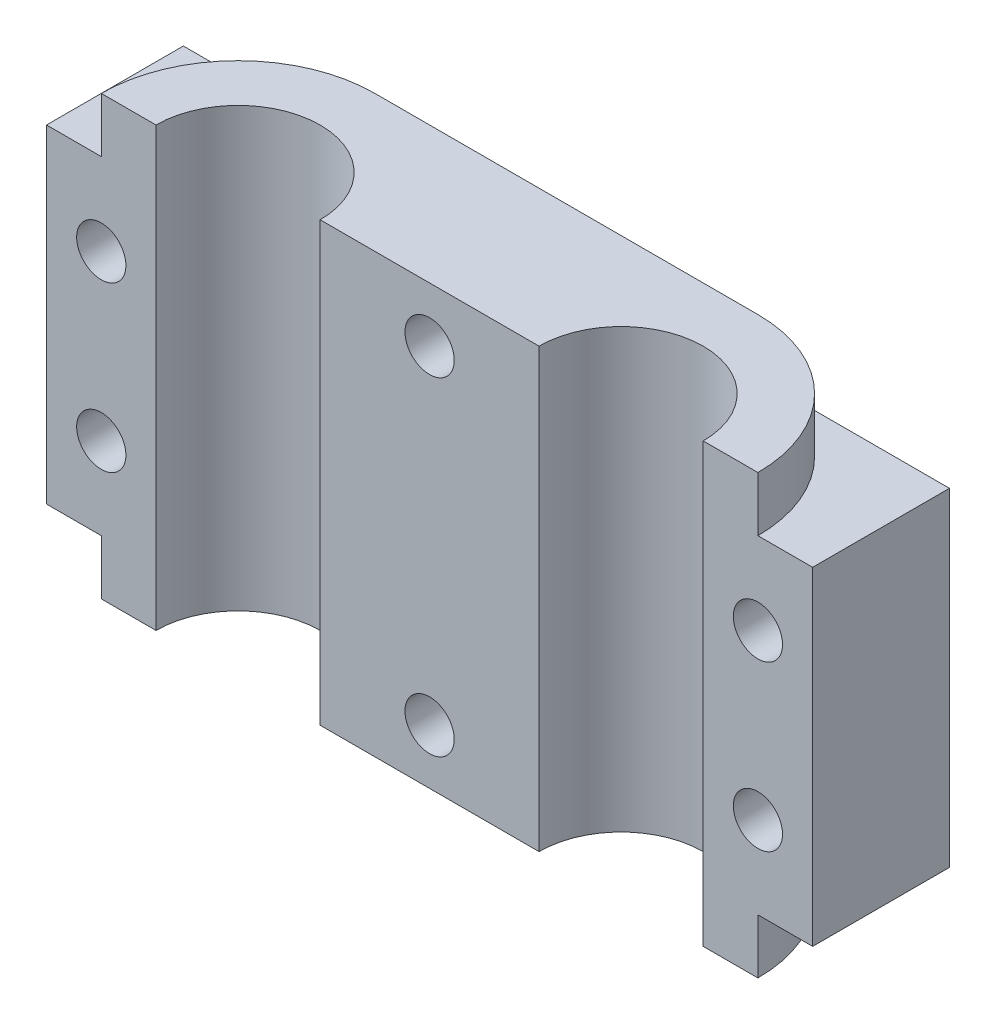
ISO-10303-21;
HEADER;
FILE_DESCRIPTION(('STEP AP214'),'2;1');
FILE_NAME('part.step','',(''),(''),'','','');
FILE_SCHEMA(('AUTOMOTIVE_DESIGN { 1 0 10303 214 1 1 1 1 }'));
ENDSEC;
DATA;
#1=APPLICATION_CONTEXT('core data for automotive mechanical design processes');
#2=APPLICATION_PROTOCOL_DEFINITION('international standard','automotive_design',2000,#1);
#3=PRODUCT_CONTEXT('',#1,'mechanical');
#4=PRODUCT('Part','Part','',(#3));
#5=PRODUCT_RELATED_PRODUCT_CATEGORY('part','',(#4));
#6=PRODUCT_DEFINITION_FORMATION('','',#4);
#7=PRODUCT_DEFINITION_CONTEXT('part definition',#1,'design');
#8=PRODUCT_DEFINITION('design','',#6,#7);
#9=PRODUCT_DEFINITION_SHAPE('','',#8);
#10=(LENGTH_UNIT() NAMED_UNIT(*) SI_UNIT(.MILLI.,.METRE.));
#11=(NAMED_UNIT(*) PLANE_ANGLE_UNIT() SI_UNIT($,.RADIAN.));
#12=(NAMED_UNIT(*) SI_UNIT($,.STERADIAN.) SOLID_ANGLE_UNIT());
#13=UNCERTAINTY_MEASURE_WITH_UNIT(LENGTH_MEASURE(1.E-05),#10,'distance_accuracy_value','');
#14=(GEOMETRIC_REPRESENTATION_CONTEXT(3) GLOBAL_UNCERTAINTY_ASSIGNED_CONTEXT((#13)) GLOBAL_UNIT_ASSIGNED_CONTEXT((#10,
#11,#12)) REPRESENTATION_CONTEXT('',''));
#15=CARTESIAN_POINT('',(0.,0.,0.));
#16=DIRECTION('',(0.,0.,1.));
#17=DIRECTION('',(1.,0.,0.));
#18=AXIS2_PLACEMENT_3D('',#15,#16,#17);
#19=CARTESIAN_POINT('',(-17.5,15.,12.6162790697674));
#20=DIRECTION('',(0.,-1.,0.));
#21=DIRECTION('',(0.,0.,-1.));
#22=AXIS2_PLACEMENT_3D('',#19,#20,#21);
#23=PLANE('',#22);
#24=DIRECTION('',(1.,0.,0.));
#25=VECTOR('',#24,1.);
#26=CARTESIAN_POINT('',(-35.,15.,12.6162790697674));
#27=LINE('',#26,#25);
#28=CARTESIAN_POINT('',(-35.,15.,12.6162790697674));
#29=VERTEX_POINT('',#28);
#30=CARTESIAN_POINT('',(-30.,15.,12.6162790697674));
#31=VERTEX_POINT('',#30);
#32=EDGE_CURVE('E232',#29,#31,#27,.T.);
#33=ORIENTED_EDGE('',*,*,#32,.T.);
#34=CARTESIAN_POINT('',(-17.5,15.,12.6162790697674));
#35=DIRECTION('',(0.,-1.,0.));
#36=DIRECTION('',(0.,0.,-1.));
#37=AXIS2_PLACEMENT_3D('',#34,#35,#36);
#38=CIRCLE('',#37,12.5);
#39=CARTESIAN_POINT('',(-17.5,15.,0.116279069767435));
#40=VERTEX_POINT('',#39);
#41=EDGE_CURVE('E52',#31,#40,#38,.T.);
#42=ORIENTED_EDGE('',*,*,#41,.T.);
#43=DIRECTION('',(-1.,0.,0.));
#44=VECTOR('',#43,1.);
#45=CARTESIAN_POINT('',(-35.,15.,0.116279069767435));
#46=LINE('',#45,#44);
#47=CARTESIAN_POINT('',(-35.,15.,0.116279069767435));
#48=VERTEX_POINT('',#47);
#49=EDGE_CURVE('E239',#40,#48,#46,.T.);
#50=ORIENTED_EDGE('',*,*,#49,.T.);
#51=DIRECTION('',(0.,0.,1.));
#52=VECTOR('',#51,1.);
#53=CARTESIAN_POINT('',(-35.,15.,0.116279069767435));
#54=LINE('',#53,#52);
#55=EDGE_CURVE('E241',#48,#29,#54,.T.);
#56=ORIENTED_EDGE('',*,*,#55,.T.);
#57=EDGE_LOOP('',(#33,#42,#50,#56));
#58=FACE_BOUND('',#57,.T.);
#59=ADVANCED_FACE('F37',(#58),#23,.F.);
#60=CARTESIAN_POINT('',(-17.5,-15.,12.6162790697674));
#61=DIRECTION('',(0.,-1.,0.));
#62=DIRECTION('',(0.,0.,-1.));
#63=AXIS2_PLACEMENT_3D('',#60,#61,#62);
#64=PLANE('',#63);
#65=CARTESIAN_POINT('',(-17.5,-15.,12.6162790697674));
#66=DIRECTION('',(0.,-1.,0.));
#67=DIRECTION('',(0.,0.,-1.));
#68=AXIS2_PLACEMENT_3D('',#65,#66,#67);
#69=CIRCLE('',#68,12.5);
#70=CARTESIAN_POINT('',(-30.,-15.,12.6162790697674));
#71=VERTEX_POINT('',#70);
#72=CARTESIAN_POINT('',(-17.5,-15.,0.116279069767435));
#73=VERTEX_POINT('',#72);
#74=EDGE_CURVE('E11',#71,#73,#69,.T.);
#75=ORIENTED_EDGE('',*,*,#74,.F.);
#76=DIRECTION('',(1.,0.,0.));
#77=VECTOR('',#76,1.);
#78=CARTESIAN_POINT('',(-35.,-15.,12.6162790697674));
#79=LINE('',#78,#77);
#80=CARTESIAN_POINT('',(-35.,-15.,12.6162790697674));
#81=VERTEX_POINT('',#80);
#82=EDGE_CURVE('E231',#81,#71,#79,.T.);
#83=ORIENTED_EDGE('',*,*,#82,.F.);
#84=DIRECTION('',(0.,0.,1.));
#85=VECTOR('',#84,1.);
#86=CARTESIAN_POINT('',(-35.,-15.,0.116279069767435));
#87=LINE('',#86,#85);
#88=CARTESIAN_POINT('',(-35.,-15.,0.116279069767435));
#89=VERTEX_POINT('',#88);
#90=EDGE_CURVE('E235',#89,#81,#87,.T.);
#91=ORIENTED_EDGE('',*,*,#90,.F.);
#92=DIRECTION('',(-1.,0.,0.));
#93=VECTOR('',#92,1.);
#94=CARTESIAN_POINT('',(-35.,-15.,0.116279069767435));
#95=LINE('',#94,#93);
#96=EDGE_CURVE('E249',#73,#89,#95,.T.);
#97=ORIENTED_EDGE('',*,*,#96,.F.);
#98=EDGE_LOOP('',(#75,#83,#91,#97));
#99=FACE_BOUND('',#98,.T.);
#100=ADVANCED_FACE('F308',(#99),#64,.T.);
#101=CARTESIAN_POINT('',(-35.,15.,12.6162790697674));
#102=DIRECTION('',(0.,0.,-1.));
#103=DIRECTION('',(-1.,0.,0.));
#104=AXIS2_PLACEMENT_3D('',#101,#102,#103);
#105=PLANE('',#104);
#106=CARTESIAN_POINT('',(-30.,-7.5,12.6162790697674));
#107=DIRECTION('',(0.,0.,1.));
#108=DIRECTION('',(1.,0.,0.));
#109=AXIS2_PLACEMENT_3D('',#106,#107,#108);
#110=CIRCLE('',#109,2.25);
#111=CARTESIAN_POINT('',(-27.75,-7.5,12.6162790697674));
#112=VERTEX_POINT('',#111);
#113=EDGE_CURVE('E361',#112,#112,#110,.T.);
#114=ORIENTED_EDGE('',*,*,#113,.F.);
#115=EDGE_LOOP('',(#114));
#116=FACE_BOUND('',#115,.T.);
#117=CARTESIAN_POINT('',(-30.,7.5,12.6162790697674));
#118=DIRECTION('',(0.,0.,1.));
#119=DIRECTION('',(1.,0.,0.));
#120=AXIS2_PLACEMENT_3D('',#117,#118,#119);
#121=CIRCLE('',#120,2.25);
#122=CARTESIAN_POINT('',(-27.75,7.5,12.6162790697674));
#123=VERTEX_POINT('',#122);
#124=EDGE_CURVE('E178',#123,#123,#121,.T.);
#125=ORIENTED_EDGE('',*,*,#124,.F.);
#126=EDGE_LOOP('',(#125));
#127=FACE_BOUND('',#126,.T.);
#128=ORIENTED_EDGE('',*,*,#82,.T.);
#129=DIRECTION('',(0.,1.,0.));
#130=VECTOR('',#129,1.);
#131=CARTESIAN_POINT('',(-30.,-20.,12.6162790697674));
#132=LINE('',#131,#130);
#133=CARTESIAN_POINT('',(-30.,-20.,12.6162790697674));
#134=VERTEX_POINT('',#133);
#135=EDGE_CURVE('E157',#134,#71,#132,.T.);
#136=ORIENTED_EDGE('',*,*,#135,.F.);
#137=DIRECTION('',(1.,0.,0.));
#138=VECTOR('',#137,1.);
#139=CARTESIAN_POINT('',(-30.,-20.,12.6162790697674));
#140=LINE('',#139,#138);
#141=CARTESIAN_POINT('',(-25.,-20.,12.6162790697674));
#142=VERTEX_POINT('',#141);
#143=EDGE_CURVE('E198',#134,#142,#140,.T.);
#144=ORIENTED_EDGE('',*,*,#143,.T.);
#145=DIRECTION('',(0.,-1.,0.));
#146=VECTOR('',#145,1.);
#147=CARTESIAN_POINT('',(-25.,15.,12.6162790697674));
#148=LINE('',#147,#146);
#149=CARTESIAN_POINT('',(-25.,20.,12.6162790697674));
#150=VERTEX_POINT('',#149);
#151=EDGE_CURVE('E164',#150,#142,#148,.T.);
#152=ORIENTED_EDGE('',*,*,#151,.F.);
#153=DIRECTION('',(1.,0.,0.));
#154=VECTOR('',#153,1.);
#155=CARTESIAN_POINT('',(-30.,20.,12.6162790697674));
#156=LINE('',#155,#154);
#157=CARTESIAN_POINT('',(-30.,20.,12.6162790697674));
#158=VERTEX_POINT('',#157);
#159=EDGE_CURVE('E161',#158,#150,#156,.T.);
#160=ORIENTED_EDGE('',*,*,#159,.F.);
#161=EDGE_CURVE('E149',#31,#158,#132,.T.);
#162=ORIENTED_EDGE('',*,*,#161,.F.);
#163=ORIENTED_EDGE('',*,*,#32,.F.);
#164=DIRECTION('',(0.,-1.,0.));
#165=VECTOR('',#164,1.);
#166=CARTESIAN_POINT('',(-35.,15.,12.6162790697674));
#167=LINE('',#166,#165);
#168=EDGE_CURVE('E243',#29,#81,#167,.T.);
#169=ORIENTED_EDGE('',*,*,#168,.T.);
#170=EDGE_LOOP('',(#128,#136,#144,#152,#160,#162,#163,#169));
#171=FACE_BOUND('',#170,.T.);
#172=ADVANCED_FACE('F39',(#116,#127,#171),#105,.F.);
#173=CARTESIAN_POINT('',(-17.5,15.,12.6162790697674));
#174=DIRECTION('',(0.,-1.,0.));
#175=DIRECTION('',(0.,0.,-1.));
#176=AXIS2_PLACEMENT_3D('',#173,#174,#175);
#177=CYLINDRICAL_SURFACE('',#176,7.5);
#178=ORIENTED_EDGE('',*,*,#151,.T.);
#179=CARTESIAN_POINT('',(-17.5,-20.,12.6162790697674));
#180=DIRECTION('',(0.,-1.,0.));
#181=DIRECTION('',(0.,0.,-1.));
#182=AXIS2_PLACEMENT_3D('',#179,#180,#181);
#183=CIRCLE('',#182,7.5);
#184=CARTESIAN_POINT('',(-10.,-20.,12.6162790697674));
#185=VERTEX_POINT('',#184);
#186=EDGE_CURVE('E200',#142,#185,#183,.T.);
#187=ORIENTED_EDGE('',*,*,#186,.T.);
#188=DIRECTION('',(0.,-1.,0.));
#189=VECTOR('',#188,1.);
#190=CARTESIAN_POINT('',(-10.,15.,12.6162790697674));
#191=LINE('',#190,#189);
#192=CARTESIAN_POINT('',(-10.,20.,12.6162790697674));
#193=VERTEX_POINT('',#192);
#194=EDGE_CURVE('E269',#193,#185,#191,.T.);
#195=ORIENTED_EDGE('',*,*,#194,.F.);
#196=CARTESIAN_POINT('',(-17.5,20.,12.6162790697674));
#197=DIRECTION('',(0.,-1.,0.));
#198=DIRECTION('',(0.,0.,-1.));
#199=AXIS2_PLACEMENT_3D('',#196,#197,#198);
#200=CIRCLE('',#199,7.5);
#201=EDGE_CURVE('E168',#150,#193,#200,.T.);
#202=ORIENTED_EDGE('',*,*,#201,.F.);
#203=EDGE_LOOP('',(#178,#187,#195,#202));
#204=FACE_BOUND('',#203,.T.);
#205=ADVANCED_FACE('F334',(#204),#177,.F.);
#206=CARTESIAN_POINT('',(-10.,15.,12.6162790697674));
#207=DIRECTION('',(0.,0.,-1.));
#208=DIRECTION('',(-1.,0.,0.));
#209=AXIS2_PLACEMENT_3D('',#206,#207,#208);
#210=PLANE('',#209);
#211=CARTESIAN_POINT('',(0.,-15.,12.6162790697674));
#212=DIRECTION('',(0.,0.,1.));
#213=DIRECTION('',(-1.,0.,0.));
#214=AXIS2_PLACEMENT_3D('',#211,#212,#213);
#215=CIRCLE('',#214,2.25);
#216=CARTESIAN_POINT('',(-2.25,-15.,12.6162790697674));
#217=VERTEX_POINT('',#216);
#218=EDGE_CURVE('E389',#217,#217,#215,.T.);
#219=ORIENTED_EDGE('',*,*,#218,.F.);
#220=EDGE_LOOP('',(#219));
#221=FACE_BOUND('',#220,.T.);
#222=CARTESIAN_POINT('',(0.,15.,12.6162790697674));
#223=DIRECTION('',(0.,0.,1.));
#224=DIRECTION('',(1.,0.,0.));
#225=AXIS2_PLACEMENT_3D('',#222,#223,#224);
#226=CIRCLE('',#225,2.25);
#227=CARTESIAN_POINT('',(2.25,15.,12.6162790697674));
#228=VERTEX_POINT('',#227);
#229=EDGE_CURVE('E369',#228,#228,#226,.T.);
#230=ORIENTED_EDGE('',*,*,#229,.F.);
#231=EDGE_LOOP('',(#230));
#232=FACE_BOUND('',#231,.T.);
#233=ORIENTED_EDGE('',*,*,#194,.T.);
#234=DIRECTION('',(1.,0.,0.));
#235=VECTOR('',#234,1.);
#236=CARTESIAN_POINT('',(-10.,-20.,12.6162790697674));
#237=LINE('',#236,#235);
#238=CARTESIAN_POINT('',(10.,-20.,12.6162790697674));
#239=VERTEX_POINT('',#238);
#240=EDGE_CURVE('E203',#185,#239,#237,.T.);
#241=ORIENTED_EDGE('',*,*,#240,.T.);
#242=DIRECTION('',(0.,-1.,0.));
#243=VECTOR('',#242,1.);
#244=CARTESIAN_POINT('',(10.,15.,12.6162790697674));
#245=LINE('',#244,#243);
#246=CARTESIAN_POINT('',(10.,20.,12.6162790697674));
#247=VERTEX_POINT('',#246);
#248=EDGE_CURVE('E267',#247,#239,#245,.T.);
#249=ORIENTED_EDGE('',*,*,#248,.F.);
#250=DIRECTION('',(1.,0.,0.));
#251=VECTOR('',#250,1.);
#252=CARTESIAN_POINT('',(-10.,20.,12.6162790697674));
#253=LINE('',#252,#251);
#254=EDGE_CURVE('E183',#193,#247,#253,.T.);
#255=ORIENTED_EDGE('',*,*,#254,.F.);
#256=EDGE_LOOP('',(#233,#241,#249,#255));
#257=FACE_BOUND('',#256,.T.);
#258=ADVANCED_FACE('F337',(#221,#232,#257),#210,.F.);
#259=CARTESIAN_POINT('',(17.5,15.,12.6162790697674));
#260=DIRECTION('',(0.,-1.,0.));
#261=DIRECTION('',(0.,0.,-1.));
#262=AXIS2_PLACEMENT_3D('',#259,#260,#261);
#263=CYLINDRICAL_SURFACE('',#262,7.5);
#264=ORIENTED_EDGE('',*,*,#248,.T.);
#265=CARTESIAN_POINT('',(17.5,-20.,12.6162790697674));
#266=DIRECTION('',(0.,-1.,0.));
#267=DIRECTION('',(0.,0.,1.));
#268=AXIS2_PLACEMENT_3D('',#265,#266,#267);
#269=CIRCLE('',#268,7.5);
#270=CARTESIAN_POINT('',(25.,-20.,12.6162790697674));
#271=VERTEX_POINT('',#270);
#272=EDGE_CURVE('E206',#239,#271,#269,.T.);
#273=ORIENTED_EDGE('',*,*,#272,.T.);
#274=DIRECTION('',(0.,-1.,0.));
#275=VECTOR('',#274,1.);
#276=CARTESIAN_POINT('',(25.,15.,12.6162790697674));
#277=LINE('',#276,#275);
#278=CARTESIAN_POINT('',(25.,20.,12.6162790697674));
#279=VERTEX_POINT('',#278);
#280=EDGE_CURVE('E265',#279,#271,#277,.T.);
#281=ORIENTED_EDGE('',*,*,#280,.F.);
#282=CARTESIAN_POINT('',(17.5,20.,12.6162790697674));
#283=DIRECTION('',(0.,-1.,0.));
#284=DIRECTION('',(0.,0.,1.));
#285=AXIS2_PLACEMENT_3D('',#282,#283,#284);
#286=CIRCLE('',#285,7.5);
#287=EDGE_CURVE('E186',#247,#279,#286,.T.);
#288=ORIENTED_EDGE('',*,*,#287,.F.);
#289=EDGE_LOOP('',(#264,#273,#281,#288));
#290=FACE_BOUND('',#289,.T.);
#291=ADVANCED_FACE('F339',(#290),#263,.F.);
#292=CARTESIAN_POINT('',(25.,15.,12.6162790697674));
#293=DIRECTION('',(0.,0.,-1.));
#294=DIRECTION('',(-1.,0.,0.));
#295=AXIS2_PLACEMENT_3D('',#292,#293,#294);
#296=PLANE('',#295);
#297=CARTESIAN_POINT('',(30.,7.5,12.6162790697674));
#298=DIRECTION('',(0.,0.,1.));
#299=DIRECTION('',(-1.,0.,0.));
#300=AXIS2_PLACEMENT_3D('',#297,#298,#299);
#301=CIRCLE('',#300,2.25);
#302=CARTESIAN_POINT('',(27.75,7.5,12.6162790697674));
#303=VERTEX_POINT('',#302);
#304=EDGE_CURVE('E383',#303,#303,#301,.T.);
#305=ORIENTED_EDGE('',*,*,#304,.F.);
#306=EDGE_LOOP('',(#305));
#307=FACE_BOUND('',#306,.T.);
#308=CARTESIAN_POINT('',(30.,-7.5,12.6162790697674));
#309=DIRECTION('',(0.,0.,1.));
#310=DIRECTION('',(-1.,0.,0.));
#311=AXIS2_PLACEMENT_3D('',#308,#309,#310);
#312=CIRCLE('',#311,2.25);
#313=CARTESIAN_POINT('',(27.75,-7.5,12.6162790697674));
#314=VERTEX_POINT('',#313);
#315=EDGE_CURVE('E377',#314,#314,#312,.T.);
#316=ORIENTED_EDGE('',*,*,#315,.F.);
#317=EDGE_LOOP('',(#316));
#318=FACE_BOUND('',#317,.T.);
#319=DIRECTION('',(1.,0.,0.));
#320=VECTOR('',#319,1.);
#321=CARTESIAN_POINT('',(25.,15.,12.6162790697674));
#322=LINE('',#321,#320);
#323=CARTESIAN_POINT('',(30.,15.,12.6162790697674));
#324=VERTEX_POINT('',#323);
#325=CARTESIAN_POINT('',(35.,15.,12.6162790697674));
#326=VERTEX_POINT('',#325);
#327=EDGE_CURVE('E234',#324,#326,#322,.T.);
#328=ORIENTED_EDGE('',*,*,#327,.F.);
#329=DIRECTION('',(0.,1.,0.));
#330=VECTOR('',#329,1.);
#331=CARTESIAN_POINT('',(30.,-20.,12.6162790697674));
#332=LINE('',#331,#330);
#333=CARTESIAN_POINT('',(30.,20.,12.6162790697674));
#334=VERTEX_POINT('',#333);
#335=EDGE_CURVE('E227',#324,#334,#332,.T.);
#336=ORIENTED_EDGE('',*,*,#335,.T.);
#337=DIRECTION('',(1.,0.,0.));
#338=VECTOR('',#337,1.);
#339=CARTESIAN_POINT('',(30.,20.,12.6162790697674));
#340=LINE('',#339,#338);
#341=EDGE_CURVE('E189',#279,#334,#340,.T.);
#342=ORIENTED_EDGE('',*,*,#341,.F.);
#343=ORIENTED_EDGE('',*,*,#280,.T.);
#344=DIRECTION('',(1.,0.,0.));
#345=VECTOR('',#344,1.);
#346=CARTESIAN_POINT('',(30.,-20.,12.6162790697674));
#347=LINE('',#346,#345);
#348=CARTESIAN_POINT('',(30.,-20.,12.6162790697674));
#349=VERTEX_POINT('',#348);
#350=EDGE_CURVE('E209',#271,#349,#347,.T.);
#351=ORIENTED_EDGE('',*,*,#350,.T.);
#352=CARTESIAN_POINT('',(30.,-15.,12.6162790697674));
#353=VERTEX_POINT('',#352);
#354=EDGE_CURVE('E225',#349,#353,#332,.T.);
#355=ORIENTED_EDGE('',*,*,#354,.T.);
#356=DIRECTION('',(1.,0.,0.));
#357=VECTOR('',#356,1.);
#358=CARTESIAN_POINT('',(25.,-15.,12.6162790697674));
#359=LINE('',#358,#357);
#360=CARTESIAN_POINT('',(35.,-15.,12.6162790697674));
#361=VERTEX_POINT('',#360);
#362=EDGE_CURVE('E245',#353,#361,#359,.T.);
#363=ORIENTED_EDGE('',*,*,#362,.T.);
#364=DIRECTION('',(0.,-1.,0.));
#365=VECTOR('',#364,1.);
#366=CARTESIAN_POINT('',(35.,15.,12.6162790697674));
#367=LINE('',#366,#365);
#368=EDGE_CURVE('E262',#326,#361,#367,.T.);
#369=ORIENTED_EDGE('',*,*,#368,.F.);
#370=EDGE_LOOP('',(#328,#336,#342,#343,#351,#355,#363,#369));
#371=FACE_BOUND('',#370,.T.);
#372=ADVANCED_FACE('F280',(#307,#318,#371),#296,.F.);
#373=CARTESIAN_POINT('',(35.,15.,12.6162790697674));
#374=DIRECTION('',(-1.,0.,0.));
#375=DIRECTION('',(0.,0.,1.));
#376=AXIS2_PLACEMENT_3D('',#373,#374,#375);
#377=PLANE('',#376);
#378=DIRECTION('',(0.,0.,-1.));
#379=VECTOR('',#378,1.);
#380=CARTESIAN_POINT('',(35.,-15.,12.6162790697674));
#381=LINE('',#380,#379);
#382=CARTESIAN_POINT('',(35.,-15.,0.116279069767435));
#383=VERTEX_POINT('',#382);
#384=EDGE_CURVE('E247',#361,#383,#381,.T.);
#385=ORIENTED_EDGE('',*,*,#384,.T.);
#386=DIRECTION('',(0.,-1.,0.));
#387=VECTOR('',#386,1.);
#388=CARTESIAN_POINT('',(35.,15.,0.116279069767435));
#389=LINE('',#388,#387);
#390=CARTESIAN_POINT('',(35.,15.,0.116279069767435));
#391=VERTEX_POINT('',#390);
#392=EDGE_CURVE('E259',#391,#383,#389,.T.);
#393=ORIENTED_EDGE('',*,*,#392,.F.);
#394=DIRECTION('',(0.,0.,-1.));
#395=VECTOR('',#394,1.);
#396=CARTESIAN_POINT('',(35.,15.,12.6162790697674));
#397=LINE('',#396,#395);
#398=EDGE_CURVE('E237',#326,#391,#397,.T.);
#399=ORIENTED_EDGE('',*,*,#398,.F.);
#400=ORIENTED_EDGE('',*,*,#368,.T.);
#401=EDGE_LOOP('',(#385,#393,#399,#400));
#402=FACE_BOUND('',#401,.T.);
#403=ADVANCED_FACE('F287',(#402),#377,.F.);
#404=CARTESIAN_POINT('',(-35.,15.,0.116279069767435));
#405=DIRECTION('',(0.,0.,1.));
#406=DIRECTION('',(1.,0.,0.));
#407=AXIS2_PLACEMENT_3D('',#404,#405,#406);
#408=PLANE('',#407);
#409=CARTESIAN_POINT('',(0.,-15.,0.116279069767432));
#410=DIRECTION('',(0.,0.,1.));
#411=DIRECTION('',(-1.,0.,0.));
#412=AXIS2_PLACEMENT_3D('',#409,#410,#411);
#413=CIRCLE('',#412,2.25);
#414=CARTESIAN_POINT('',(-2.25,-15.,0.116279069767432));
#415=VERTEX_POINT('',#414);
#416=EDGE_CURVE('E392',#415,#415,#413,.T.);
#417=ORIENTED_EDGE('',*,*,#416,.T.);
#418=EDGE_LOOP('',(#417));
#419=FACE_BOUND('',#418,.T.);
#420=CARTESIAN_POINT('',(30.,7.5,0.116279069767432));
#421=DIRECTION('',(0.,0.,1.));
#422=DIRECTION('',(-1.,0.,0.));
#423=AXIS2_PLACEMENT_3D('',#420,#421,#422);
#424=CIRCLE('',#423,2.25);
#425=CARTESIAN_POINT('',(27.75,7.5,0.116279069767432));
#426=VERTEX_POINT('',#425);
#427=EDGE_CURVE('E386',#426,#426,#424,.T.);
#428=ORIENTED_EDGE('',*,*,#427,.T.);
#429=EDGE_LOOP('',(#428));
#430=FACE_BOUND('',#429,.T.);
#431=CARTESIAN_POINT('',(30.,-7.5,0.116279069767432));
#432=DIRECTION('',(0.,0.,1.));
#433=DIRECTION('',(-1.,0.,0.));
#434=AXIS2_PLACEMENT_3D('',#431,#432,#433);
#435=CIRCLE('',#434,2.25);
#436=CARTESIAN_POINT('',(27.75,-7.5,0.116279069767432));
#437=VERTEX_POINT('',#436);
#438=EDGE_CURVE('E380',#437,#437,#435,.T.);
#439=ORIENTED_EDGE('',*,*,#438,.T.);
#440=EDGE_LOOP('',(#439));
#441=FACE_BOUND('',#440,.T.);
#442=CARTESIAN_POINT('',(0.,15.,0.116279069767432));
#443=DIRECTION('',(0.,0.,1.));
#444=DIRECTION('',(1.,0.,0.));
#445=AXIS2_PLACEMENT_3D('',#442,#443,#444);
#446=CIRCLE('',#445,2.25);
#447=CARTESIAN_POINT('',(2.25,15.,0.116279069767432));
#448=VERTEX_POINT('',#447);
#449=EDGE_CURVE('E374',#448,#448,#446,.T.);
#450=ORIENTED_EDGE('',*,*,#449,.T.);
#451=EDGE_LOOP('',(#450));
#452=FACE_BOUND('',#451,.T.);
#453=CARTESIAN_POINT('',(-30.,-7.5,0.116279069767432));
#454=DIRECTION('',(0.,0.,1.));
#455=DIRECTION('',(1.,0.,0.));
#456=AXIS2_PLACEMENT_3D('',#453,#454,#455);
#457=CIRCLE('',#456,2.25);
#458=CARTESIAN_POINT('',(-27.75,-7.5,0.116279069767432));
#459=VERTEX_POINT('',#458);
#460=EDGE_CURVE('E365',#459,#459,#457,.T.);
#461=ORIENTED_EDGE('',*,*,#460,.T.);
#462=EDGE_LOOP('',(#461));
#463=FACE_BOUND('',#462,.T.);
#464=CARTESIAN_POINT('',(-30.,7.5,0.116279069767432));
#465=DIRECTION('',(0.,0.,1.));
#466=DIRECTION('',(1.,0.,0.));
#467=AXIS2_PLACEMENT_3D('',#464,#465,#466);
#468=CIRCLE('',#467,2.25);
#469=CARTESIAN_POINT('',(-27.75,7.5,0.116279069767432));
#470=VERTEX_POINT('',#469);
#471=EDGE_CURVE('E175',#470,#470,#468,.T.);
#472=ORIENTED_EDGE('',*,*,#471,.T.);
#473=EDGE_LOOP('',(#472));
#474=FACE_BOUND('',#473,.T.);
#475=CARTESIAN_POINT('',(17.5,-15.,0.116279069767434));
#476=VERTEX_POINT('',#475);
#477=EDGE_CURVE('E250',#383,#476,#95,.T.);
#478=ORIENTED_EDGE('',*,*,#477,.T.);
#479=DIRECTION('',(0.,1.,0.));
#480=VECTOR('',#479,1.);
#481=CARTESIAN_POINT('',(17.5,-20.,0.116279069767434));
#482=LINE('',#481,#480);
#483=CARTESIAN_POINT('',(17.5,-20.,0.116279069767434));
#484=VERTEX_POINT('',#483);
#485=EDGE_CURVE('E222',#484,#476,#482,.T.);
#486=ORIENTED_EDGE('',*,*,#485,.F.);
#487=DIRECTION('',(-1.,0.,0.));
#488=VECTOR('',#487,1.);
#489=CARTESIAN_POINT('',(-17.5,-20.,0.116279069767435));
#490=LINE('',#489,#488);
#491=CARTESIAN_POINT('',(-17.5,-20.,0.116279069767435));
#492=VERTEX_POINT('',#491);
#493=EDGE_CURVE('E158',#484,#492,#490,.T.);
#494=ORIENTED_EDGE('',*,*,#493,.T.);
#495=DIRECTION('',(0.,1.,0.));
#496=VECTOR('',#495,1.);
#497=CARTESIAN_POINT('',(-17.5,-20.,0.116279069767435));
#498=LINE('',#497,#496);
#499=EDGE_CURVE('E217',#492,#73,#498,.T.);
#500=ORIENTED_EDGE('',*,*,#499,.T.);
#501=ORIENTED_EDGE('',*,*,#96,.T.);
#502=DIRECTION('',(0.,-1.,0.));
#503=VECTOR('',#502,1.);
#504=CARTESIAN_POINT('',(-35.,15.,0.116279069767435));
#505=LINE('',#504,#503);
#506=EDGE_CURVE('E256',#48,#89,#505,.T.);
#507=ORIENTED_EDGE('',*,*,#506,.F.);
#508=ORIENTED_EDGE('',*,*,#49,.F.);
#509=CARTESIAN_POINT('',(-17.5,20.,0.116279069767435));
#510=VERTEX_POINT('',#509);
#511=EDGE_CURVE('E221',#40,#510,#498,.T.);
#512=ORIENTED_EDGE('',*,*,#511,.T.);
#513=DIRECTION('',(-1.,0.,0.));
#514=VECTOR('',#513,1.);
#515=CARTESIAN_POINT('',(-17.5,20.,0.116279069767435));
#516=LINE('',#515,#514);
#517=CARTESIAN_POINT('',(17.5,20.,0.116279069767434));
#518=VERTEX_POINT('',#517);
#519=EDGE_CURVE('E174',#518,#510,#516,.T.);
#520=ORIENTED_EDGE('',*,*,#519,.F.);
#521=CARTESIAN_POINT('',(17.5,15.,0.116279069767435));
#522=VERTEX_POINT('',#521);
#523=EDGE_CURVE('E224',#522,#518,#482,.T.);
#524=ORIENTED_EDGE('',*,*,#523,.F.);
#525=EDGE_CURVE('E60',#391,#522,#46,.T.);
#526=ORIENTED_EDGE('',*,*,#525,.F.);
#527=ORIENTED_EDGE('',*,*,#392,.T.);
#528=EDGE_LOOP('',(#478,#486,#494,#500,#501,#507,#508,#512,#520,#524,#526,#527));
#529=FACE_BOUND('',#528,.T.);
#530=ADVANCED_FACE('F290',(#419,#430,#441,#452,#463,#474,#529),#408,.F.);
#531=CARTESIAN_POINT('',(-35.,15.,0.116279069767435));
#532=DIRECTION('',(1.,0.,0.));
#533=DIRECTION('',(0.,0.,-1.));
#534=AXIS2_PLACEMENT_3D('',#531,#532,#533);
#535=PLANE('',#534);
#536=ORIENTED_EDGE('',*,*,#90,.T.);
#537=ORIENTED_EDGE('',*,*,#168,.F.);
#538=ORIENTED_EDGE('',*,*,#55,.F.);
#539=ORIENTED_EDGE('',*,*,#506,.T.);
#540=EDGE_LOOP('',(#536,#537,#538,#539));
#541=FACE_BOUND('',#540,.T.);
#542=ADVANCED_FACE('F300',(#541),#535,.F.);
#543=ORIENTED_EDGE('',*,*,#525,.T.);
#544=CARTESIAN_POINT('',(17.5,15.,12.6162790697674));
#545=DIRECTION('',(0.,-1.,0.));
#546=DIRECTION('',(0.,0.,-1.));
#547=AXIS2_PLACEMENT_3D('',#544,#545,#546);
#548=CIRCLE('',#547,12.5);
#549=EDGE_CURVE('E220',#522,#324,#548,.T.);
#550=ORIENTED_EDGE('',*,*,#549,.T.);
#551=ORIENTED_EDGE('',*,*,#327,.T.);
#552=ORIENTED_EDGE('',*,*,#398,.T.);
#553=EDGE_LOOP('',(#543,#550,#551,#552));
#554=FACE_BOUND('',#553,.T.);
#555=ADVANCED_FACE('F298',(#554),#23,.F.);
#556=CARTESIAN_POINT('',(17.5,-15.,12.6162790697674));
#557=DIRECTION('',(0.,-1.,0.));
#558=DIRECTION('',(0.,0.,-1.));
#559=AXIS2_PLACEMENT_3D('',#556,#557,#558);
#560=CIRCLE('',#559,12.5);
#561=EDGE_CURVE('E45',#476,#353,#560,.T.);
#562=ORIENTED_EDGE('',*,*,#561,.F.);
#563=ORIENTED_EDGE('',*,*,#477,.F.);
#564=ORIENTED_EDGE('',*,*,#384,.F.);
#565=ORIENTED_EDGE('',*,*,#362,.F.);
#566=EDGE_LOOP('',(#562,#563,#564,#565));
#567=FACE_BOUND('',#566,.T.);
#568=ADVANCED_FACE('F284',(#567),#64,.T.);
#569=CARTESIAN_POINT('',(-17.5,-20.,12.6162790697674));
#570=DIRECTION('',(0.,1.,0.));
#571=DIRECTION('',(0.,0.,1.));
#572=AXIS2_PLACEMENT_3D('',#569,#570,#571);
#573=PLANE('',#572);
#574=CARTESIAN_POINT('',(-17.5,-20.,12.6162790697674));
#575=DIRECTION('',(0.,1.,0.));
#576=DIRECTION('',(0.,0.,1.));
#577=AXIS2_PLACEMENT_3D('',#574,#575,#576);
#578=CIRCLE('',#577,12.5);
#579=EDGE_CURVE('E195',#492,#134,#578,.T.);
#580=ORIENTED_EDGE('',*,*,#579,.F.);
#581=ORIENTED_EDGE('',*,*,#493,.F.);
#582=CARTESIAN_POINT('',(17.5,-20.,12.6162790697674));
#583=DIRECTION('',(0.,1.,0.));
#584=DIRECTION('',(0.,0.,1.));
#585=AXIS2_PLACEMENT_3D('',#582,#583,#584);
#586=CIRCLE('',#585,12.5);
#587=EDGE_CURVE('E212',#349,#484,#586,.T.);
#588=ORIENTED_EDGE('',*,*,#587,.F.);
#589=ORIENTED_EDGE('',*,*,#350,.F.);
#590=ORIENTED_EDGE('',*,*,#272,.F.);
#591=ORIENTED_EDGE('',*,*,#240,.F.);
#592=ORIENTED_EDGE('',*,*,#186,.F.);
#593=ORIENTED_EDGE('',*,*,#143,.F.);
#594=EDGE_LOOP('',(#580,#581,#588,#589,#590,#591,#592,#593));
#595=FACE_BOUND('',#594,.T.);
#596=ADVANCED_FACE('F306',(#595),#573,.F.);
#597=CARTESIAN_POINT('',(17.5,-20.,12.6162790697674));
#598=DIRECTION('',(0.,1.,0.));
#599=DIRECTION('',(0.,0.,1.));
#600=AXIS2_PLACEMENT_3D('',#597,#598,#599);
#601=CYLINDRICAL_SURFACE('',#600,12.5);
#602=ORIENTED_EDGE('',*,*,#485,.T.);
#603=ORIENTED_EDGE('',*,*,#561,.T.);
#604=ORIENTED_EDGE('',*,*,#354,.F.);
#605=ORIENTED_EDGE('',*,*,#587,.T.);
#606=EDGE_LOOP('',(#602,#603,#604,#605));
#607=FACE_BOUND('',#606,.T.);
#608=ADVANCED_FACE('F273',(#607),#601,.T.);
#609=CARTESIAN_POINT('',(-17.5,-20.,12.6162790697674));
#610=DIRECTION('',(0.,1.,0.));
#611=DIRECTION('',(0.,0.,1.));
#612=AXIS2_PLACEMENT_3D('',#609,#610,#611);
#613=CYLINDRICAL_SURFACE('',#612,12.5);
#614=ORIENTED_EDGE('',*,*,#135,.T.);
#615=ORIENTED_EDGE('',*,*,#74,.T.);
#616=ORIENTED_EDGE('',*,*,#499,.F.);
#617=ORIENTED_EDGE('',*,*,#579,.T.);
#618=EDGE_LOOP('',(#614,#615,#616,#617));
#619=FACE_BOUND('',#618,.T.);
#620=ADVANCED_FACE('F324',(#619),#613,.T.);
#621=ORIENTED_EDGE('',*,*,#41,.F.);
#622=ORIENTED_EDGE('',*,*,#161,.T.);
#623=CARTESIAN_POINT('',(-17.5,20.,12.6162790697674));
#624=DIRECTION('',(0.,1.,0.));
#625=DIRECTION('',(0.,0.,1.));
#626=AXIS2_PLACEMENT_3D('',#623,#624,#625);
#627=CIRCLE('',#626,12.5);
#628=EDGE_CURVE('E154',#510,#158,#627,.T.);
#629=ORIENTED_EDGE('',*,*,#628,.F.);
#630=ORIENTED_EDGE('',*,*,#511,.F.);
#631=EDGE_LOOP('',(#621,#622,#629,#630));
#632=FACE_BOUND('',#631,.T.);
#633=ADVANCED_FACE('F151',(#632),#613,.T.);
#634=ORIENTED_EDGE('',*,*,#549,.F.);
#635=ORIENTED_EDGE('',*,*,#523,.T.);
#636=CARTESIAN_POINT('',(17.5,20.,12.6162790697674));
#637=DIRECTION('',(0.,1.,0.));
#638=DIRECTION('',(0.,0.,1.));
#639=AXIS2_PLACEMENT_3D('',#636,#637,#638);
#640=CIRCLE('',#639,12.5);
#641=EDGE_CURVE('E192',#334,#518,#640,.T.);
#642=ORIENTED_EDGE('',*,*,#641,.F.);
#643=ORIENTED_EDGE('',*,*,#335,.F.);
#644=EDGE_LOOP('',(#634,#635,#642,#643));
#645=FACE_BOUND('',#644,.T.);
#646=ADVANCED_FACE('F294',(#645),#601,.T.);
#647=CARTESIAN_POINT('',(-17.5,20.,12.6162790697674));
#648=DIRECTION('',(0.,1.,0.));
#649=DIRECTION('',(0.,0.,1.));
#650=AXIS2_PLACEMENT_3D('',#647,#648,#649);
#651=PLANE('',#650);
#652=ORIENTED_EDGE('',*,*,#628,.T.);
#653=ORIENTED_EDGE('',*,*,#159,.T.);
#654=ORIENTED_EDGE('',*,*,#201,.T.);
#655=ORIENTED_EDGE('',*,*,#254,.T.);
#656=ORIENTED_EDGE('',*,*,#287,.T.);
#657=ORIENTED_EDGE('',*,*,#341,.T.);
#658=ORIENTED_EDGE('',*,*,#641,.T.);
#659=ORIENTED_EDGE('',*,*,#519,.T.);
#660=EDGE_LOOP('',(#652,#653,#654,#655,#656,#657,#658,#659));
#661=FACE_BOUND('',#660,.T.);
#662=ADVANCED_FACE('F171',(#661),#651,.T.);
#663=CARTESIAN_POINT('',(-30.,7.5,0.116279069767432));
#664=DIRECTION('',(0.,0.,1.));
#665=DIRECTION('',(1.,0.,0.));
#666=AXIS2_PLACEMENT_3D('',#663,#664,#665);
#667=CYLINDRICAL_SURFACE('',#666,2.25);
#668=ORIENTED_EDGE('',*,*,#471,.F.);
#669=EDGE_LOOP('',(#668));
#670=FACE_BOUND('',#669,.T.);
#671=ORIENTED_EDGE('',*,*,#124,.T.);
#672=EDGE_LOOP('',(#671));
#673=FACE_BOUND('',#672,.T.);
#674=ADVANCED_FACE('F419',(#670,#673),#667,.F.);
#675=CARTESIAN_POINT('',(-30.,-7.5,0.116279069767432));
#676=DIRECTION('',(0.,0.,1.));
#677=DIRECTION('',(1.,0.,0.));
#678=AXIS2_PLACEMENT_3D('',#675,#676,#677);
#679=CYLINDRICAL_SURFACE('',#678,2.25);
#680=ORIENTED_EDGE('',*,*,#460,.F.);
#681=EDGE_LOOP('',(#680));
#682=FACE_BOUND('',#681,.T.);
#683=ORIENTED_EDGE('',*,*,#113,.T.);
#684=EDGE_LOOP('',(#683));
#685=FACE_BOUND('',#684,.T.);
#686=ADVANCED_FACE('F410',(#682,#685),#679,.F.);
#687=CARTESIAN_POINT('',(0.,15.,0.116279069767432));
#688=DIRECTION('',(0.,0.,1.));
#689=DIRECTION('',(1.,0.,0.));
#690=AXIS2_PLACEMENT_3D('',#687,#688,#689);
#691=CYLINDRICAL_SURFACE('',#690,2.25);
#692=ORIENTED_EDGE('',*,*,#449,.F.);
#693=EDGE_LOOP('',(#692));
#694=FACE_BOUND('',#693,.T.);
#695=ORIENTED_EDGE('',*,*,#229,.T.);
#696=EDGE_LOOP('',(#695));
#697=FACE_BOUND('',#696,.T.);
#698=ADVANCED_FACE('F407',(#694,#697),#691,.F.);
#699=CARTESIAN_POINT('',(30.,-7.5,0.116279069767432));
#700=DIRECTION('',(0.,0.,1.));
#701=DIRECTION('',(1.,0.,0.));
#702=AXIS2_PLACEMENT_3D('',#699,#700,#701);
#703=CYLINDRICAL_SURFACE('',#702,2.25);
#704=ORIENTED_EDGE('',*,*,#438,.F.);
#705=EDGE_LOOP('',(#704));
#706=FACE_BOUND('',#705,.T.);
#707=ORIENTED_EDGE('',*,*,#315,.T.);
#708=EDGE_LOOP('',(#707));
#709=FACE_BOUND('',#708,.T.);
#710=ADVANCED_FACE('F409',(#706,#709),#703,.F.);
#711=CARTESIAN_POINT('',(30.,7.5,0.116279069767432));
#712=DIRECTION('',(0.,0.,1.));
#713=DIRECTION('',(1.,0.,0.));
#714=AXIS2_PLACEMENT_3D('',#711,#712,#713);
#715=CYLINDRICAL_SURFACE('',#714,2.25);
#716=ORIENTED_EDGE('',*,*,#427,.F.);
#717=EDGE_LOOP('',(#716));
#718=FACE_BOUND('',#717,.T.);
#719=ORIENTED_EDGE('',*,*,#304,.T.);
#720=EDGE_LOOP('',(#719));
#721=FACE_BOUND('',#720,.T.);
#722=ADVANCED_FACE('F401',(#718,#721),#715,.F.);
#723=CARTESIAN_POINT('',(0.,-15.,0.116279069767432));
#724=DIRECTION('',(0.,0.,1.));
#725=DIRECTION('',(1.,0.,0.));
#726=AXIS2_PLACEMENT_3D('',#723,#724,#725);
#727=CYLINDRICAL_SURFACE('',#726,2.25);
#728=ORIENTED_EDGE('',*,*,#416,.F.);
#729=EDGE_LOOP('',(#728));
#730=FACE_BOUND('',#729,.T.);
#731=ORIENTED_EDGE('',*,*,#218,.T.);
#732=EDGE_LOOP('',(#731));
#733=FACE_BOUND('',#732,.T.);
#734=ADVANCED_FACE('F398',(#730,#733),#727,.F.);
#735=CLOSED_SHELL('',(#59,#100,#172,#205,#258,#291,#372,#403,#530,#542,#555,#568,#596,#608,#620,
#633,#646,#662,#674,#686,#698,#710,#722,#734));
#736=MANIFOLD_SOLID_BREP('B2',#735);
#737=ADVANCED_BREP_SHAPE_REPRESENTATION('',(#18,#736),#14);
#738=SHAPE_DEFINITION_REPRESENTATION(#9,#737);
ENDSEC;
END-ISO-10303-21;
